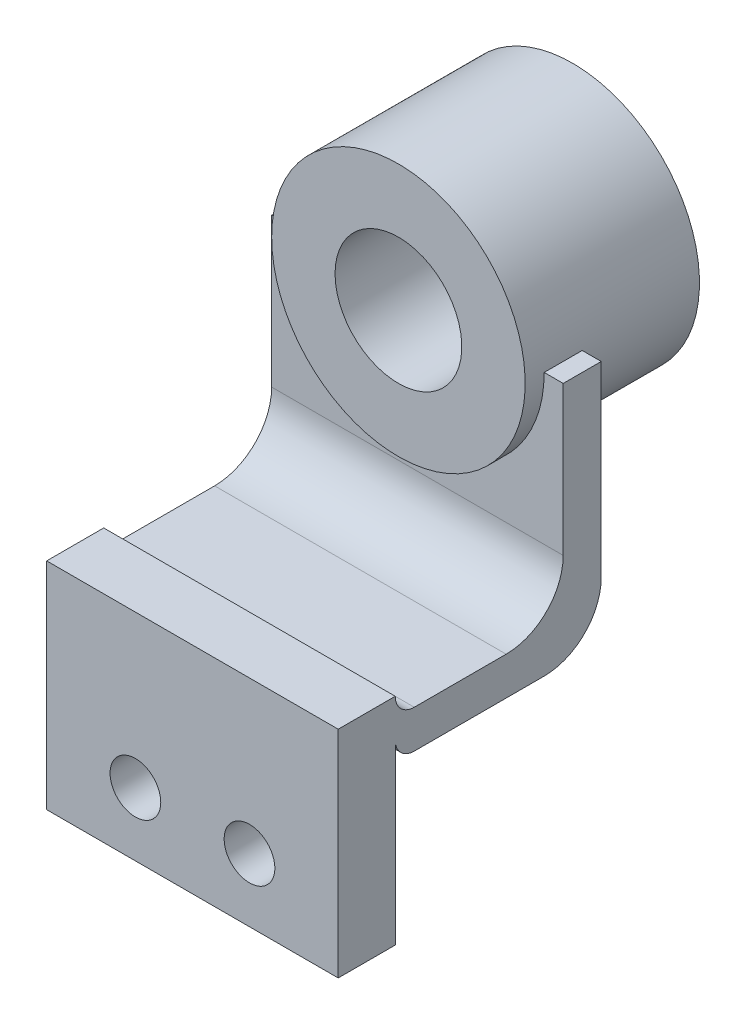
ISO-10303-21;
HEADER;
FILE_DESCRIPTION(('STEP AP214'),'2;1');
FILE_NAME('part.step','',(''),(''),'','','');
FILE_SCHEMA(('AUTOMOTIVE_DESIGN { 1 0 10303 214 1 1 1 1 }'));
ENDSEC;
DATA;
#1=APPLICATION_CONTEXT('core data for automotive mechanical design processes');
#2=APPLICATION_PROTOCOL_DEFINITION('international standard','automotive_design',2000,#1);
#3=PRODUCT_CONTEXT('',#1,'mechanical');
#4=PRODUCT('Part','Part','',(#3));
#5=PRODUCT_RELATED_PRODUCT_CATEGORY('part','',(#4));
#6=PRODUCT_DEFINITION_FORMATION('','',#4);
#7=PRODUCT_DEFINITION_CONTEXT('part definition',#1,'design');
#8=PRODUCT_DEFINITION('design','',#6,#7);
#9=PRODUCT_DEFINITION_SHAPE('','',#8);
#10=(LENGTH_UNIT() NAMED_UNIT(*) SI_UNIT(.MILLI.,.METRE.));
#11=(NAMED_UNIT(*) PLANE_ANGLE_UNIT() SI_UNIT($,.RADIAN.));
#12=(NAMED_UNIT(*) SI_UNIT($,.STERADIAN.) SOLID_ANGLE_UNIT());
#13=UNCERTAINTY_MEASURE_WITH_UNIT(LENGTH_MEASURE(1.E-05),#10,'distance_accuracy_value','');
#14=(GEOMETRIC_REPRESENTATION_CONTEXT(3) GLOBAL_UNCERTAINTY_ASSIGNED_CONTEXT((#13)) GLOBAL_UNIT_ASSIGNED_CONTEXT((#10,
#11,#12)) REPRESENTATION_CONTEXT('',''));
#15=CARTESIAN_POINT('',(0.,0.,0.));
#16=DIRECTION('',(0.,0.,1.));
#17=DIRECTION('',(1.,0.,0.));
#18=AXIS2_PLACEMENT_3D('',#15,#16,#17);
#19=CARTESIAN_POINT('',(0.,0.,0.));
#20=DIRECTION('',(0.,0.,1.));
#21=DIRECTION('',(1.,0.,0.));
#22=AXIS2_PLACEMENT_3D('',#19,#20,#21);
#23=PLANE('',#22);
#24=CARTESIAN_POINT('',(-18.,-14.,0.));
#25=DIRECTION('',(0.,0.,-1.));
#26=DIRECTION('',(1.,0.,0.));
#27=AXIS2_PLACEMENT_3D('',#24,#25,#26);
#28=CIRCLE('',#27,8.00000000000001);
#29=CARTESIAN_POINT('',(-9.99999999999998,-14.,0.));
#30=VERTEX_POINT('',#29);
#31=EDGE_CURVE('E337',#30,#30,#28,.T.);
#32=ORIENTED_EDGE('',*,*,#31,.F.);
#33=EDGE_LOOP('',(#32));
#34=FACE_BOUND('',#33,.T.);
#35=DIRECTION('',(0.,1.,0.));
#36=VECTOR('',#35,1.);
#37=CARTESIAN_POINT('',(-7.,0.,0.));
#38=LINE('',#37,#36);
#39=CARTESIAN_POINT('',(-7.,-34.,0.));
#40=VERTEX_POINT('',#39);
#41=CARTESIAN_POINT('',(-7.,22.,0.));
#42=VERTEX_POINT('',#41);
#43=EDGE_CURVE('E239',#40,#42,#38,.T.);
#44=ORIENTED_EDGE('',*,*,#43,.F.);
#45=DIRECTION('',(1.,0.,0.));
#46=VECTOR('',#45,1.);
#47=CARTESIAN_POINT('',(46.,-34.,0.));
#48=LINE('',#47,#46);
#49=CARTESIAN_POINT('',(-46.,-34.,0.));
#50=VERTEX_POINT('',#49);
#51=EDGE_CURVE('E387',#50,#40,#48,.T.);
#52=ORIENTED_EDGE('',*,*,#51,.F.);
#53=DIRECTION('',(0.,-1.,0.));
#54=VECTOR('',#53,1.);
#55=CARTESIAN_POINT('',(-46.,-34.,0.));
#56=LINE('',#55,#54);
#57=CARTESIAN_POINT('',(-46.,22.,0.));
#58=VERTEX_POINT('',#57);
#59=EDGE_CURVE('E365',#58,#50,#56,.T.);
#60=ORIENTED_EDGE('',*,*,#59,.F.);
#61=DIRECTION('',(-1.,0.,0.));
#62=VECTOR('',#61,1.);
#63=CARTESIAN_POINT('',(46.,22.,0.));
#64=LINE('',#63,#62);
#65=EDGE_CURVE('E338',#42,#58,#64,.T.);
#66=ORIENTED_EDGE('',*,*,#65,.F.);
#67=EDGE_LOOP('',(#44,#52,#60,#66));
#68=FACE_BOUND('',#67,.T.);
#69=ADVANCED_FACE('F33',(#34,#68),#23,.F.);
#70=CARTESIAN_POINT('',(46.,22.,-6.));
#71=DIRECTION('',(-1.,0.,0.));
#72=DIRECTION('',(0.,0.,1.));
#73=AXIS2_PLACEMENT_3D('',#70,#71,#72);
#74=CYLINDRICAL_SURFACE('',#73,6.);
#75=DIRECTION('',(-1.,0.,0.));
#76=VECTOR('',#75,1.);
#77=CARTESIAN_POINT('',(46.,16.,-6.00000000000004));
#78=LINE('',#77,#76);
#79=CARTESIAN_POINT('',(-7.,16.,-6.00000000000004));
#80=VERTEX_POINT('',#79);
#81=CARTESIAN_POINT('',(-46.,16.,-6.00000000000004));
#82=VERTEX_POINT('',#81);
#83=EDGE_CURVE('E342',#80,#82,#78,.T.);
#84=ORIENTED_EDGE('',*,*,#83,.F.);
#85=CARTESIAN_POINT('',(-7.,22.,-6.));
#86=DIRECTION('',(1.,0.,0.));
#87=DIRECTION('',(0.,0.,-1.));
#88=AXIS2_PLACEMENT_3D('',#85,#86,#87);
#89=CIRCLE('',#88,6.);
#90=EDGE_CURVE('E244',#80,#42,#89,.F.);
#91=ORIENTED_EDGE('',*,*,#90,.T.);
#92=ORIENTED_EDGE('',*,*,#65,.T.);
#93=CARTESIAN_POINT('',(-46.,22.,-6.));
#94=DIRECTION('',(-1.,0.,0.));
#95=DIRECTION('',(0.,0.,1.));
#96=AXIS2_PLACEMENT_3D('',#93,#94,#95);
#97=CIRCLE('',#96,6.);
#98=EDGE_CURVE('E291',#82,#58,#97,.T.);
#99=ORIENTED_EDGE('',*,*,#98,.F.);
#100=EDGE_LOOP('',(#84,#91,#92,#99));
#101=FACE_BOUND('',#100,.T.);
#102=ADVANCED_FACE('F458',(#101),#74,.T.);
#103=CARTESIAN_POINT('',(46.,16.,-6.00000000000004));
#104=DIRECTION('',(0.,-1.,0.));
#105=DIRECTION('',(0.,0.,-1.));
#106=AXIS2_PLACEMENT_3D('',#103,#104,#105);
#107=PLANE('',#106);
#108=DIRECTION('',(-1.,0.,0.));
#109=VECTOR('',#108,1.);
#110=CARTESIAN_POINT('',(46.,16.,-46.9999999999999));
#111=LINE('',#110,#109);
#112=CARTESIAN_POINT('',(-7.,16.,-46.9999999999999));
#113=VERTEX_POINT('',#112);
#114=CARTESIAN_POINT('',(-46.,16.,-46.9999999999999));
#115=VERTEX_POINT('',#114);
#116=EDGE_CURVE('E346',#113,#115,#111,.T.);
#117=ORIENTED_EDGE('',*,*,#116,.F.);
#118=DIRECTION('',(0.,0.,1.));
#119=VECTOR('',#118,1.);
#120=CARTESIAN_POINT('',(-7.,16.,-6.00000000000004));
#121=LINE('',#120,#119);
#122=EDGE_CURVE('E247',#113,#80,#121,.T.);
#123=ORIENTED_EDGE('',*,*,#122,.T.);
#124=ORIENTED_EDGE('',*,*,#83,.T.);
#125=DIRECTION('',(0.,0.,1.));
#126=VECTOR('',#125,1.);
#127=CARTESIAN_POINT('',(-46.,16.,-6.00000000000004));
#128=LINE('',#127,#126);
#129=EDGE_CURVE('E329',#115,#82,#128,.T.);
#130=ORIENTED_EDGE('',*,*,#129,.F.);
#131=EDGE_LOOP('',(#117,#123,#124,#130));
#132=FACE_BOUND('',#131,.T.);
#133=ADVANCED_FACE('F463',(#132),#107,.T.);
#134=CARTESIAN_POINT('',(46.,34.,-47.));
#135=DIRECTION('',(-1.,0.,0.));
#136=DIRECTION('',(0.,0.,1.));
#137=AXIS2_PLACEMENT_3D('',#134,#135,#136);
#138=CYLINDRICAL_SURFACE('',#137,18.);
#139=DIRECTION('',(-1.,0.,0.));
#140=VECTOR('',#139,1.);
#141=CARTESIAN_POINT('',(46.,34.0000000000001,-65.));
#142=LINE('',#141,#140);
#143=CARTESIAN_POINT('',(-7.,34.,-65.));
#144=VERTEX_POINT('',#143);
#145=CARTESIAN_POINT('',(-46.,34.0000000000001,-65.));
#146=VERTEX_POINT('',#145);
#147=EDGE_CURVE('E350',#144,#146,#142,.T.);
#148=ORIENTED_EDGE('',*,*,#147,.F.);
#149=CARTESIAN_POINT('',(-7.,34.,-47.));
#150=DIRECTION('',(1.,0.,0.));
#151=DIRECTION('',(0.,0.,-1.));
#152=AXIS2_PLACEMENT_3D('',#149,#150,#151);
#153=CIRCLE('',#152,18.);
#154=EDGE_CURVE('E250',#144,#113,#153,.F.);
#155=ORIENTED_EDGE('',*,*,#154,.T.);
#156=ORIENTED_EDGE('',*,*,#116,.T.);
#157=CARTESIAN_POINT('',(-46.,34.,-47.));
#158=DIRECTION('',(-1.,0.,0.));
#159=DIRECTION('',(0.,0.,-1.));
#160=AXIS2_PLACEMENT_3D('',#157,#158,#159);
#161=CIRCLE('',#160,18.);
#162=EDGE_CURVE('E326',#146,#115,#161,.T.);
#163=ORIENTED_EDGE('',*,*,#162,.F.);
#164=EDGE_LOOP('',(#148,#155,#156,#163));
#165=FACE_BOUND('',#164,.T.);
#166=ADVANCED_FACE('F468',(#165),#138,.T.);
#167=CARTESIAN_POINT('',(46.,34.0000000000001,-65.));
#168=DIRECTION('',(0.,0.,-1.));
#169=DIRECTION('',(-1.,0.,0.));
#170=AXIS2_PLACEMENT_3D('',#167,#168,#169);
#171=PLANE('',#170);
#172=CARTESIAN_POINT('',(0.,93.,-65.));
#173=DIRECTION('',(0.,0.,-1.));
#174=DIRECTION('',(-1.,0.,0.));
#175=AXIS2_PLACEMENT_3D('',#172,#173,#174);
#176=CIRCLE('',#175,40.);
#177=CARTESIAN_POINT('',(-7.,53.6172626649696,-65.));
#178=VERTEX_POINT('',#177);
#179=CARTESIAN_POINT('',(-40.,93.,-65.));
#180=VERTEX_POINT('',#179);
#181=EDGE_CURVE('E284',#178,#180,#176,.T.);
#182=ORIENTED_EDGE('',*,*,#181,.F.);
#183=DIRECTION('',(0.,-1.,0.));
#184=VECTOR('',#183,1.);
#185=CARTESIAN_POINT('',(-7.,34.0000000000001,-65.));
#186=LINE('',#185,#184);
#187=EDGE_CURVE('E242',#178,#144,#186,.T.);
#188=ORIENTED_EDGE('',*,*,#187,.T.);
#189=ORIENTED_EDGE('',*,*,#147,.T.);
#190=DIRECTION('',(0.,-1.,0.));
#191=VECTOR('',#190,1.);
#192=CARTESIAN_POINT('',(-46.,34.0000000000001,-65.));
#193=LINE('',#192,#191);
#194=CARTESIAN_POINT('',(-46.,93.,-65.));
#195=VERTEX_POINT('',#194);
#196=EDGE_CURVE('E323',#195,#146,#193,.T.);
#197=ORIENTED_EDGE('',*,*,#196,.F.);
#198=DIRECTION('',(-1.,0.,0.));
#199=VECTOR('',#198,1.);
#200=CARTESIAN_POINT('',(46.,93.,-65.));
#201=LINE('',#200,#199);
#202=EDGE_CURVE('E354',#180,#195,#201,.T.);
#203=ORIENTED_EDGE('',*,*,#202,.F.);
#204=EDGE_LOOP('',(#182,#188,#189,#197,#203));
#205=FACE_BOUND('',#204,.T.);
#206=ADVANCED_FACE('F473',(#205),#171,.T.);
#207=CARTESIAN_POINT('',(46.,93.,-65.));
#208=DIRECTION('',(0.,1.,0.));
#209=DIRECTION('',(0.,0.,1.));
#210=AXIS2_PLACEMENT_3D('',#207,#208,#209);
#211=PLANE('',#210);
#212=DIRECTION('',(0.,0.,-1.));
#213=VECTOR('',#212,1.);
#214=CARTESIAN_POINT('',(40.,93.,-47.));
#215=LINE('',#214,#213);
#216=CARTESIAN_POINT('',(40.,93.,-53.));
#217=VERTEX_POINT('',#216);
#218=CARTESIAN_POINT('',(40.,93.,-65.));
#219=VERTEX_POINT('',#218);
#220=EDGE_CURVE('E281',#217,#219,#215,.T.);
#221=ORIENTED_EDGE('',*,*,#220,.F.);
#222=DIRECTION('',(-1.,0.,0.));
#223=VECTOR('',#222,1.);
#224=CARTESIAN_POINT('',(46.,93.,-53.));
#225=LINE('',#224,#223);
#226=CARTESIAN_POINT('',(46.,93.,-53.));
#227=VERTEX_POINT('',#226);
#228=EDGE_CURVE('E355',#227,#217,#225,.T.);
#229=ORIENTED_EDGE('',*,*,#228,.F.);
#230=DIRECTION('',(0.,0.,-1.));
#231=VECTOR('',#230,1.);
#232=CARTESIAN_POINT('',(46.,93.,-65.));
#233=LINE('',#232,#231);
#234=CARTESIAN_POINT('',(46.,93.,-65.));
#235=VERTEX_POINT('',#234);
#236=EDGE_CURVE('E297',#227,#235,#233,.T.);
#237=ORIENTED_EDGE('',*,*,#236,.T.);
#238=EDGE_CURVE('E351',#235,#219,#201,.T.);
#239=ORIENTED_EDGE('',*,*,#238,.T.);
#240=EDGE_LOOP('',(#221,#229,#237,#239));
#241=FACE_BOUND('',#240,.T.);
#242=ADVANCED_FACE('F478',(#241),#211,.T.);
#243=CARTESIAN_POINT('',(18.,-14.,0.));
#244=DIRECTION('',(0.,0.,-1.));
#245=DIRECTION('',(-1.,0.,0.));
#246=AXIS2_PLACEMENT_3D('',#243,#244,#245);
#247=CIRCLE('',#246,8.);
#248=CARTESIAN_POINT('',(9.99999999999997,-14.,0.));
#249=VERTEX_POINT('',#248);
#250=EDGE_CURVE('E366',#249,#249,#247,.T.);
#251=ORIENTED_EDGE('',*,*,#250,.F.);
#252=EDGE_LOOP('',(#251));
#253=FACE_BOUND('',#252,.T.);
#254=CARTESIAN_POINT('',(7.,-34.,0.));
#255=VERTEX_POINT('',#254);
#256=CARTESIAN_POINT('',(46.,-34.,0.));
#257=VERTEX_POINT('',#256);
#258=EDGE_CURVE('E386',#255,#257,#48,.T.);
#259=ORIENTED_EDGE('',*,*,#258,.F.);
#260=DIRECTION('',(0.,1.,0.));
#261=VECTOR('',#260,1.);
#262=CARTESIAN_POINT('',(7.,0.,0.));
#263=LINE('',#262,#261);
#264=CARTESIAN_POINT('',(7.,22.,0.));
#265=VERTEX_POINT('',#264);
#266=EDGE_CURVE('E241',#255,#265,#263,.T.);
#267=ORIENTED_EDGE('',*,*,#266,.T.);
#268=CARTESIAN_POINT('',(46.,22.,0.));
#269=VERTEX_POINT('',#268);
#270=EDGE_CURVE('E334',#269,#265,#64,.T.);
#271=ORIENTED_EDGE('',*,*,#270,.F.);
#272=DIRECTION('',(0.,1.,0.));
#273=VECTOR('',#272,1.);
#274=CARTESIAN_POINT('',(46.,-34.,0.));
#275=LINE('',#274,#273);
#276=EDGE_CURVE('E390',#257,#269,#275,.T.);
#277=ORIENTED_EDGE('',*,*,#276,.F.);
#278=EDGE_LOOP('',(#259,#267,#271,#277));
#279=FACE_BOUND('',#278,.T.);
#280=ADVANCED_FACE('F502',(#253,#279),#23,.F.);
#281=CARTESIAN_POINT('',(-46.,-34.,18.));
#282=DIRECTION('',(1.,0.,0.));
#283=DIRECTION('',(0.,0.,-1.));
#284=AXIS2_PLACEMENT_3D('',#281,#282,#283);
#285=PLANE('',#284);
#286=DIRECTION('',(0.,0.,-1.));
#287=VECTOR('',#286,1.);
#288=CARTESIAN_POINT('',(-46.,34.,18.));
#289=LINE('',#288,#287);
#290=CARTESIAN_POINT('',(-46.,34.,18.));
#291=VERTEX_POINT('',#290);
#292=CARTESIAN_POINT('',(-46.,34.,0.));
#293=VERTEX_POINT('',#292);
#294=EDGE_CURVE('E384',#291,#293,#289,.T.);
#295=ORIENTED_EDGE('',*,*,#294,.T.);
#296=CARTESIAN_POINT('',(-46.,34.,-6.));
#297=DIRECTION('',(1.,0.,0.));
#298=DIRECTION('',(0.,0.,-1.));
#299=AXIS2_PLACEMENT_3D('',#296,#297,#298);
#300=CIRCLE('',#299,6.);
#301=CARTESIAN_POINT('',(-46.,28.,-6.));
#302=VERTEX_POINT('',#301);
#303=EDGE_CURVE('E408',#293,#302,#300,.T.);
#304=ORIENTED_EDGE('',*,*,#303,.T.);
#305=DIRECTION('',(0.,0.,-1.));
#306=VECTOR('',#305,1.);
#307=CARTESIAN_POINT('',(-46.,28.,0.));
#308=LINE('',#307,#306);
#309=CARTESIAN_POINT('',(-46.,28.,-34.9999999999999));
#310=VERTEX_POINT('',#309);
#311=EDGE_CURVE('E287',#302,#310,#308,.T.);
#312=ORIENTED_EDGE('',*,*,#311,.T.);
#313=CARTESIAN_POINT('',(-46.,46.,-35.));
#314=DIRECTION('',(1.,0.,0.));
#315=DIRECTION('',(0.,0.,-1.));
#316=AXIS2_PLACEMENT_3D('',#313,#314,#315);
#317=CIRCLE('',#316,18.);
#318=CARTESIAN_POINT('',(-46.,46.,-53.));
#319=VERTEX_POINT('',#318);
#320=EDGE_CURVE('E314',#310,#319,#317,.T.);
#321=ORIENTED_EDGE('',*,*,#320,.T.);
#322=DIRECTION('',(0.,1.,0.));
#323=VECTOR('',#322,1.);
#324=CARTESIAN_POINT('',(-46.,46.0000000000001,-53.));
#325=LINE('',#324,#323);
#326=CARTESIAN_POINT('',(-46.,93.,-53.));
#327=VERTEX_POINT('',#326);
#328=EDGE_CURVE('E317',#319,#327,#325,.T.);
#329=ORIENTED_EDGE('',*,*,#328,.T.);
#330=DIRECTION('',(0.,0.,-1.));
#331=VECTOR('',#330,1.);
#332=CARTESIAN_POINT('',(-46.,93.,-65.));
#333=LINE('',#332,#331);
#334=EDGE_CURVE('E320',#327,#195,#333,.T.);
#335=ORIENTED_EDGE('',*,*,#334,.T.);
#336=ORIENTED_EDGE('',*,*,#196,.T.);
#337=ORIENTED_EDGE('',*,*,#162,.T.);
#338=ORIENTED_EDGE('',*,*,#129,.T.);
#339=ORIENTED_EDGE('',*,*,#98,.T.);
#340=ORIENTED_EDGE('',*,*,#59,.T.);
#341=DIRECTION('',(0.,0.,-1.));
#342=VECTOR('',#341,1.);
#343=CARTESIAN_POINT('',(-46.,-34.,18.));
#344=LINE('',#343,#342);
#345=CARTESIAN_POINT('',(-46.,-34.,18.));
#346=VERTEX_POINT('',#345);
#347=EDGE_CURVE('E403',#346,#50,#344,.T.);
#348=ORIENTED_EDGE('',*,*,#347,.F.);
#349=DIRECTION('',(0.,-1.,0.));
#350=VECTOR('',#349,1.);
#351=CARTESIAN_POINT('',(-46.,-34.,18.));
#352=LINE('',#351,#350);
#353=EDGE_CURVE('E374',#291,#346,#352,.T.);
#354=ORIENTED_EDGE('',*,*,#353,.F.);
#355=EDGE_LOOP('',(#295,#304,#312,#321,#329,#335,#336,#337,#338,#339,#340,#348,#354));
#356=FACE_BOUND('',#355,.T.);
#357=ADVANCED_FACE('F505',(#356),#285,.F.);
#358=CARTESIAN_POINT('',(46.,-34.,18.));
#359=DIRECTION('',(0.,1.,0.));
#360=DIRECTION('',(-1.,0.,0.));
#361=AXIS2_PLACEMENT_3D('',#358,#359,#360);
#362=PLANE('',#361);
#363=DIRECTION('',(0.,0.,-1.));
#364=VECTOR('',#363,1.);
#365=CARTESIAN_POINT('',(46.,-34.,18.));
#366=LINE('',#365,#364);
#367=CARTESIAN_POINT('',(46.,-34.,18.));
#368=VERTEX_POINT('',#367);
#369=EDGE_CURVE('E400',#368,#257,#366,.T.);
#370=ORIENTED_EDGE('',*,*,#369,.F.);
#371=DIRECTION('',(1.,0.,0.));
#372=VECTOR('',#371,1.);
#373=CARTESIAN_POINT('',(46.,-34.,18.));
#374=LINE('',#373,#372);
#375=EDGE_CURVE('E377',#346,#368,#374,.T.);
#376=ORIENTED_EDGE('',*,*,#375,.F.);
#377=ORIENTED_EDGE('',*,*,#347,.T.);
#378=ORIENTED_EDGE('',*,*,#51,.T.);
#379=EDGE_CURVE('E391',#40,#255,#48,.T.);
#380=ORIENTED_EDGE('',*,*,#379,.T.);
#381=ORIENTED_EDGE('',*,*,#258,.T.);
#382=EDGE_LOOP('',(#370,#376,#377,#378,#380,#381));
#383=FACE_BOUND('',#382,.T.);
#384=ADVANCED_FACE('F513',(#383),#362,.F.);
#385=CARTESIAN_POINT('',(46.,-34.,18.));
#386=DIRECTION('',(-1.,0.,0.));
#387=DIRECTION('',(0.,-1.,0.));
#388=AXIS2_PLACEMENT_3D('',#385,#386,#387);
#389=PLANE('',#388);
#390=ORIENTED_EDGE('',*,*,#276,.T.);
#391=CARTESIAN_POINT('',(46.,22.,-6.));
#392=DIRECTION('',(-1.,0.,0.));
#393=DIRECTION('',(0.,0.,1.));
#394=AXIS2_PLACEMENT_3D('',#391,#392,#393);
#395=CIRCLE('',#394,6.);
#396=CARTESIAN_POINT('',(46.,16.,-6.00000000000004));
#397=VERTEX_POINT('',#396);
#398=EDGE_CURVE('E309',#397,#269,#395,.T.);
#399=ORIENTED_EDGE('',*,*,#398,.F.);
#400=DIRECTION('',(0.,0.,1.));
#401=VECTOR('',#400,1.);
#402=CARTESIAN_POINT('',(46.,16.,-6.00000000000004));
#403=LINE('',#402,#401);
#404=CARTESIAN_POINT('',(46.,16.,-46.9999999999999));
#405=VERTEX_POINT('',#404);
#406=EDGE_CURVE('E306',#405,#397,#403,.T.);
#407=ORIENTED_EDGE('',*,*,#406,.F.);
#408=CARTESIAN_POINT('',(46.,34.,-47.));
#409=DIRECTION('',(-1.,0.,0.));
#410=DIRECTION('',(0.,0.,-1.));
#411=AXIS2_PLACEMENT_3D('',#408,#409,#410);
#412=CIRCLE('',#411,18.);
#413=CARTESIAN_POINT('',(46.,34.0000000000001,-65.));
#414=VERTEX_POINT('',#413);
#415=EDGE_CURVE('E303',#414,#405,#412,.T.);
#416=ORIENTED_EDGE('',*,*,#415,.F.);
#417=DIRECTION('',(0.,-1.,0.));
#418=VECTOR('',#417,1.);
#419=CARTESIAN_POINT('',(46.,34.0000000000001,-65.));
#420=LINE('',#419,#418);
#421=EDGE_CURVE('E300',#235,#414,#420,.T.);
#422=ORIENTED_EDGE('',*,*,#421,.F.);
#423=ORIENTED_EDGE('',*,*,#236,.F.);
#424=DIRECTION('',(0.,1.,0.));
#425=VECTOR('',#424,1.);
#426=CARTESIAN_POINT('',(46.,46.0000000000001,-53.));
#427=LINE('',#426,#425);
#428=CARTESIAN_POINT('',(46.,46.,-53.));
#429=VERTEX_POINT('',#428);
#430=EDGE_CURVE('E294',#429,#227,#427,.T.);
#431=ORIENTED_EDGE('',*,*,#430,.F.);
#432=CARTESIAN_POINT('',(46.,46.,-35.));
#433=DIRECTION('',(1.,0.,0.));
#434=DIRECTION('',(0.,0.,-1.));
#435=AXIS2_PLACEMENT_3D('',#432,#433,#434);
#436=CIRCLE('',#435,18.);
#437=CARTESIAN_POINT('',(46.,28.,-34.9999999999999));
#438=VERTEX_POINT('',#437);
#439=EDGE_CURVE('E290',#438,#429,#436,.T.);
#440=ORIENTED_EDGE('',*,*,#439,.F.);
#441=DIRECTION('',(0.,0.,-1.));
#442=VECTOR('',#441,1.);
#443=CARTESIAN_POINT('',(46.,28.,0.));
#444=LINE('',#443,#442);
#445=CARTESIAN_POINT('',(46.,28.,-6.));
#446=VERTEX_POINT('',#445);
#447=EDGE_CURVE('E288',#446,#438,#444,.T.);
#448=ORIENTED_EDGE('',*,*,#447,.F.);
#449=CARTESIAN_POINT('',(46.,34.,-6.));
#450=DIRECTION('',(-1.,0.,0.));
#451=DIRECTION('',(0.,-1.,0.));
#452=AXIS2_PLACEMENT_3D('',#449,#450,#451);
#453=CIRCLE('',#452,6.);
#454=CARTESIAN_POINT('',(46.,34.,0.));
#455=VERTEX_POINT('',#454);
#456=EDGE_CURVE('E410',#446,#455,#453,.T.);
#457=ORIENTED_EDGE('',*,*,#456,.T.);
#458=DIRECTION('',(0.,0.,-1.));
#459=VECTOR('',#458,1.);
#460=CARTESIAN_POINT('',(46.,34.,18.));
#461=LINE('',#460,#459);
#462=CARTESIAN_POINT('',(46.,34.,18.));
#463=VERTEX_POINT('',#462);
#464=EDGE_CURVE('E397',#463,#455,#461,.T.);
#465=ORIENTED_EDGE('',*,*,#464,.F.);
#466=DIRECTION('',(0.,1.,0.));
#467=VECTOR('',#466,1.);
#468=CARTESIAN_POINT('',(46.,-34.,18.));
#469=LINE('',#468,#467);
#470=EDGE_CURVE('E380',#368,#463,#469,.T.);
#471=ORIENTED_EDGE('',*,*,#470,.F.);
#472=ORIENTED_EDGE('',*,*,#369,.T.);
#473=EDGE_LOOP('',(#390,#399,#407,#416,#422,#423,#431,#440,#448,#457,#465,#471,#472));
#474=FACE_BOUND('',#473,.T.);
#475=ADVANCED_FACE('F509',(#474),#389,.F.);
#476=CARTESIAN_POINT('',(46.,34.,18.));
#477=DIRECTION('',(0.,-1.,0.));
#478=DIRECTION('',(1.,0.,0.));
#479=AXIS2_PLACEMENT_3D('',#476,#477,#478);
#480=PLANE('',#479);
#481=DIRECTION('',(-1.,0.,0.));
#482=VECTOR('',#481,1.);
#483=CARTESIAN_POINT('',(46.,34.,0.));
#484=LINE('',#483,#482);
#485=EDGE_CURVE('E378',#455,#293,#484,.T.);
#486=ORIENTED_EDGE('',*,*,#485,.T.);
#487=ORIENTED_EDGE('',*,*,#294,.F.);
#488=DIRECTION('',(-1.,0.,0.));
#489=VECTOR('',#488,1.);
#490=CARTESIAN_POINT('',(46.,34.,18.));
#491=LINE('',#490,#489);
#492=EDGE_CURVE('E382',#463,#291,#491,.T.);
#493=ORIENTED_EDGE('',*,*,#492,.F.);
#494=ORIENTED_EDGE('',*,*,#464,.T.);
#495=EDGE_LOOP('',(#486,#487,#493,#494));
#496=FACE_BOUND('',#495,.T.);
#497=ADVANCED_FACE('F500',(#496),#480,.F.);
#498=CARTESIAN_POINT('',(0.,0.,18.));
#499=DIRECTION('',(0.,0.,1.));
#500=DIRECTION('',(1.,0.,0.));
#501=AXIS2_PLACEMENT_3D('',#498,#499,#500);
#502=PLANE('',#501);
#503=ORIENTED_EDGE('',*,*,#492,.T.);
#504=ORIENTED_EDGE('',*,*,#353,.T.);
#505=ORIENTED_EDGE('',*,*,#375,.T.);
#506=ORIENTED_EDGE('',*,*,#470,.T.);
#507=EDGE_LOOP('',(#503,#504,#505,#506));
#508=FACE_BOUND('',#507,.T.);
#509=CARTESIAN_POINT('',(18.,-14.,18.));
#510=DIRECTION('',(0.,0.,-1.));
#511=DIRECTION('',(-1.,0.,0.));
#512=AXIS2_PLACEMENT_3D('',#509,#510,#511);
#513=CIRCLE('',#512,8.);
#514=CARTESIAN_POINT('',(9.99999999999997,-14.,18.));
#515=VERTEX_POINT('',#514);
#516=EDGE_CURVE('E362',#515,#515,#513,.T.);
#517=ORIENTED_EDGE('',*,*,#516,.T.);
#518=EDGE_LOOP('',(#517));
#519=FACE_BOUND('',#518,.T.);
#520=CARTESIAN_POINT('',(-18.,-14.,18.));
#521=DIRECTION('',(0.,0.,-1.));
#522=DIRECTION('',(1.,0.,0.));
#523=AXIS2_PLACEMENT_3D('',#520,#521,#522);
#524=CIRCLE('',#523,8.00000000000001);
#525=CARTESIAN_POINT('',(-9.99999999999998,-14.,18.));
#526=VERTEX_POINT('',#525);
#527=EDGE_CURVE('E369',#526,#526,#524,.T.);
#528=ORIENTED_EDGE('',*,*,#527,.T.);
#529=EDGE_LOOP('',(#528));
#530=FACE_BOUND('',#529,.T.);
#531=ADVANCED_FACE('F496',(#508,#519,#530),#502,.T.);
#532=CARTESIAN_POINT('',(-18.,-14.,18.));
#533=DIRECTION('',(0.,0.,-1.));
#534=DIRECTION('',(-1.,0.,0.));
#535=AXIS2_PLACEMENT_3D('',#532,#533,#534);
#536=CYLINDRICAL_SURFACE('',#535,8.00000000000001);
#537=ORIENTED_EDGE('',*,*,#527,.F.);
#538=EDGE_LOOP('',(#537));
#539=FACE_BOUND('',#538,.T.);
#540=ORIENTED_EDGE('',*,*,#31,.T.);
#541=EDGE_LOOP('',(#540));
#542=FACE_BOUND('',#541,.T.);
#543=ADVANCED_FACE('F492',(#539,#542),#536,.F.);
#544=CARTESIAN_POINT('',(18.,-14.,18.));
#545=DIRECTION('',(0.,0.,-1.));
#546=DIRECTION('',(-1.,0.,0.));
#547=AXIS2_PLACEMENT_3D('',#544,#545,#546);
#548=CYLINDRICAL_SURFACE('',#547,8.);
#549=ORIENTED_EDGE('',*,*,#516,.F.);
#550=EDGE_LOOP('',(#549));
#551=FACE_BOUND('',#550,.T.);
#552=ORIENTED_EDGE('',*,*,#250,.T.);
#553=EDGE_LOOP('',(#552));
#554=FACE_BOUND('',#553,.T.);
#555=ADVANCED_FACE('F456',(#551,#554),#548,.F.);
#556=CARTESIAN_POINT('',(7.,22.,-6.));
#557=DIRECTION('',(1.,0.,0.));
#558=DIRECTION('',(0.,0.,-1.));
#559=AXIS2_PLACEMENT_3D('',#556,#557,#558);
#560=CIRCLE('',#559,6.);
#561=CARTESIAN_POINT('',(7.,16.,-6.00000000000004));
#562=VERTEX_POINT('',#561);
#563=EDGE_CURVE('E260',#562,#265,#560,.F.);
#564=ORIENTED_EDGE('',*,*,#563,.F.);
#565=EDGE_CURVE('E339',#397,#562,#78,.T.);
#566=ORIENTED_EDGE('',*,*,#565,.F.);
#567=ORIENTED_EDGE('',*,*,#398,.T.);
#568=ORIENTED_EDGE('',*,*,#270,.T.);
#569=EDGE_LOOP('',(#564,#566,#567,#568));
#570=FACE_BOUND('',#569,.T.);
#571=ADVANCED_FACE('F452',(#570),#74,.T.);
#572=DIRECTION('',(0.,0.,1.));
#573=VECTOR('',#572,1.);
#574=CARTESIAN_POINT('',(7.,16.,-6.00000000000004));
#575=LINE('',#574,#573);
#576=CARTESIAN_POINT('',(7.,16.,-46.9999999999999));
#577=VERTEX_POINT('',#576);
#578=EDGE_CURVE('E262',#577,#562,#575,.T.);
#579=ORIENTED_EDGE('',*,*,#578,.F.);
#580=EDGE_CURVE('E343',#405,#577,#111,.T.);
#581=ORIENTED_EDGE('',*,*,#580,.F.);
#582=ORIENTED_EDGE('',*,*,#406,.T.);
#583=ORIENTED_EDGE('',*,*,#565,.T.);
#584=EDGE_LOOP('',(#579,#581,#582,#583));
#585=FACE_BOUND('',#584,.T.);
#586=ADVANCED_FACE('F455',(#585),#107,.T.);
#587=CARTESIAN_POINT('',(7.,34.,-47.));
#588=DIRECTION('',(1.,0.,0.));
#589=DIRECTION('',(0.,0.,-1.));
#590=AXIS2_PLACEMENT_3D('',#587,#588,#589);
#591=CIRCLE('',#590,18.);
#592=CARTESIAN_POINT('',(7.,34.,-65.));
#593=VERTEX_POINT('',#592);
#594=EDGE_CURVE('E264',#593,#577,#591,.F.);
#595=ORIENTED_EDGE('',*,*,#594,.F.);
#596=EDGE_CURVE('E347',#414,#593,#142,.T.);
#597=ORIENTED_EDGE('',*,*,#596,.F.);
#598=ORIENTED_EDGE('',*,*,#415,.T.);
#599=ORIENTED_EDGE('',*,*,#580,.T.);
#600=EDGE_LOOP('',(#595,#597,#598,#599));
#601=FACE_BOUND('',#600,.T.);
#602=ADVANCED_FACE('F461',(#601),#138,.T.);
#603=DIRECTION('',(0.,-1.,0.));
#604=VECTOR('',#603,1.);
#605=CARTESIAN_POINT('',(7.,34.0000000000001,-65.));
#606=LINE('',#605,#604);
#607=CARTESIAN_POINT('',(7.,53.6172626649696,-65.));
#608=VERTEX_POINT('',#607);
#609=EDGE_CURVE('E257',#608,#593,#606,.T.);
#610=ORIENTED_EDGE('',*,*,#609,.F.);
#611=EDGE_CURVE('E285',#219,#608,#176,.T.);
#612=ORIENTED_EDGE('',*,*,#611,.F.);
#613=ORIENTED_EDGE('',*,*,#238,.F.);
#614=ORIENTED_EDGE('',*,*,#421,.T.);
#615=ORIENTED_EDGE('',*,*,#596,.T.);
#616=EDGE_LOOP('',(#610,#612,#613,#614,#615));
#617=FACE_BOUND('',#616,.T.);
#618=ADVANCED_FACE('F466',(#617),#171,.T.);
#619=DIRECTION('',(0.,0.,-1.));
#620=VECTOR('',#619,1.);
#621=CARTESIAN_POINT('',(-40.,93.,-47.));
#622=LINE('',#621,#620);
#623=CARTESIAN_POINT('',(-40.,93.,-53.));
#624=VERTEX_POINT('',#623);
#625=EDGE_CURVE('E278',#180,#624,#622,.F.);
#626=ORIENTED_EDGE('',*,*,#625,.F.);
#627=ORIENTED_EDGE('',*,*,#202,.T.);
#628=ORIENTED_EDGE('',*,*,#334,.F.);
#629=EDGE_CURVE('E358',#624,#327,#225,.T.);
#630=ORIENTED_EDGE('',*,*,#629,.F.);
#631=EDGE_LOOP('',(#626,#627,#628,#630));
#632=FACE_BOUND('',#631,.T.);
#633=ADVANCED_FACE('F471',(#632),#211,.T.);
#634=CARTESIAN_POINT('',(46.,46.0000000000001,-53.));
#635=DIRECTION('',(0.,0.,1.));
#636=DIRECTION('',(1.,0.,0.));
#637=AXIS2_PLACEMENT_3D('',#634,#635,#636);
#638=PLANE('',#637);
#639=ORIENTED_EDGE('',*,*,#228,.T.);
#640=CARTESIAN_POINT('',(0.,93.,-53.));
#641=DIRECTION('',(0.,0.,1.));
#642=DIRECTION('',(1.,0.,0.));
#643=AXIS2_PLACEMENT_3D('',#640,#641,#642);
#644=CIRCLE('',#643,40.);
#645=EDGE_CURVE('E412',#624,#217,#644,.T.);
#646=ORIENTED_EDGE('',*,*,#645,.F.);
#647=ORIENTED_EDGE('',*,*,#629,.T.);
#648=ORIENTED_EDGE('',*,*,#328,.F.);
#649=DIRECTION('',(-1.,0.,0.));
#650=VECTOR('',#649,1.);
#651=CARTESIAN_POINT('',(46.,46.,-53.));
#652=LINE('',#651,#650);
#653=EDGE_CURVE('E359',#429,#319,#652,.T.);
#654=ORIENTED_EDGE('',*,*,#653,.F.);
#655=ORIENTED_EDGE('',*,*,#430,.T.);
#656=EDGE_LOOP('',(#639,#646,#647,#648,#654,#655));
#657=FACE_BOUND('',#656,.T.);
#658=ADVANCED_FACE('F476',(#657),#638,.T.);
#659=CARTESIAN_POINT('',(46.,46.,-35.));
#660=DIRECTION('',(-1.,0.,0.));
#661=DIRECTION('',(0.,0.,1.));
#662=AXIS2_PLACEMENT_3D('',#659,#660,#661);
#663=CYLINDRICAL_SURFACE('',#662,18.);
#664=ORIENTED_EDGE('',*,*,#653,.T.);
#665=ORIENTED_EDGE('',*,*,#320,.F.);
#666=DIRECTION('',(-1.,0.,0.));
#667=VECTOR('',#666,1.);
#668=CARTESIAN_POINT('',(46.,28.,-34.9999999999999));
#669=LINE('',#668,#667);
#670=EDGE_CURVE('E311',#438,#310,#669,.T.);
#671=ORIENTED_EDGE('',*,*,#670,.F.);
#672=ORIENTED_EDGE('',*,*,#439,.T.);
#673=EDGE_LOOP('',(#664,#665,#671,#672));
#674=FACE_BOUND('',#673,.T.);
#675=ADVANCED_FACE('F481',(#674),#663,.F.);
#676=CARTESIAN_POINT('',(46.,28.,0.));
#677=DIRECTION('',(0.,1.,0.));
#678=DIRECTION('',(0.,0.,1.));
#679=AXIS2_PLACEMENT_3D('',#676,#677,#678);
#680=PLANE('',#679);
#681=ORIENTED_EDGE('',*,*,#670,.T.);
#682=ORIENTED_EDGE('',*,*,#311,.F.);
#683=DIRECTION('',(-1.,0.,0.));
#684=VECTOR('',#683,1.);
#685=CARTESIAN_POINT('',(46.,28.,-6.));
#686=LINE('',#685,#684);
#687=EDGE_CURVE('E406',#302,#446,#686,.F.);
#688=ORIENTED_EDGE('',*,*,#687,.T.);
#689=ORIENTED_EDGE('',*,*,#447,.T.);
#690=EDGE_LOOP('',(#681,#682,#688,#689));
#691=FACE_BOUND('',#690,.T.);
#692=ADVANCED_FACE('F485',(#691),#680,.T.);
#693=CARTESIAN_POINT('',(0.,34.,-6.));
#694=DIRECTION('',(-1.,0.,0.));
#695=DIRECTION('',(0.,0.,1.));
#696=AXIS2_PLACEMENT_3D('',#693,#694,#695);
#697=CYLINDRICAL_SURFACE('',#696,6.);
#698=ORIENTED_EDGE('',*,*,#456,.F.);
#699=ORIENTED_EDGE('',*,*,#687,.F.);
#700=ORIENTED_EDGE('',*,*,#303,.F.);
#701=ORIENTED_EDGE('',*,*,#485,.F.);
#702=EDGE_LOOP('',(#698,#699,#700,#701));
#703=FACE_BOUND('',#702,.T.);
#704=ADVANCED_FACE('F450',(#703),#697,.F.);
#705=CARTESIAN_POINT('',(0.,93.,-47.));
#706=DIRECTION('',(0.,0.,-1.));
#707=DIRECTION('',(-1.,0.,0.));
#708=AXIS2_PLACEMENT_3D('',#705,#706,#707);
#709=CYLINDRICAL_SURFACE('',#708,40.);
#710=CARTESIAN_POINT('',(0.,93.,-47.));
#711=DIRECTION('',(0.,0.,-1.));
#712=DIRECTION('',(-1.,0.,0.));
#713=AXIS2_PLACEMENT_3D('',#710,#711,#712);
#714=CIRCLE('',#713,40.);
#715=CARTESIAN_POINT('',(-40.,93.,-47.));
#716=VERTEX_POINT('',#715);
#717=EDGE_CURVE('E275',#716,#716,#714,.T.);
#718=ORIENTED_EDGE('',*,*,#717,.T.);
#719=EDGE_LOOP('',(#718));
#720=FACE_BOUND('',#719,.T.);
#721=DIRECTION('',(0.,0.,-1.));
#722=VECTOR('',#721,1.);
#723=CARTESIAN_POINT('',(7.,53.6172626649696,-47.));
#724=LINE('',#723,#722);
#725=CARTESIAN_POINT('',(7.,53.6172626649696,-95.));
#726=VERTEX_POINT('',#725);
#727=EDGE_CURVE('E54',#726,#608,#724,.F.);
#728=ORIENTED_EDGE('',*,*,#727,.F.);
#729=CARTESIAN_POINT('',(0.,93.,-95.));
#730=DIRECTION('',(0.,0.,1.));
#731=DIRECTION('',(1.,0.,0.));
#732=AXIS2_PLACEMENT_3D('',#729,#730,#731);
#733=CIRCLE('',#732,40.);
#734=CARTESIAN_POINT('',(-7.,53.6172626649696,-95.));
#735=VERTEX_POINT('',#734);
#736=EDGE_CURVE('E415',#726,#735,#733,.F.);
#737=ORIENTED_EDGE('',*,*,#736,.T.);
#738=DIRECTION('',(0.,0.,-1.));
#739=VECTOR('',#738,1.);
#740=CARTESIAN_POINT('',(-7.,53.6172626649696,-47.));
#741=LINE('',#740,#739);
#742=EDGE_CURVE('E61',#735,#178,#741,.F.);
#743=ORIENTED_EDGE('',*,*,#742,.T.);
#744=ORIENTED_EDGE('',*,*,#181,.T.);
#745=ORIENTED_EDGE('',*,*,#625,.T.);
#746=ORIENTED_EDGE('',*,*,#645,.T.);
#747=ORIENTED_EDGE('',*,*,#220,.T.);
#748=ORIENTED_EDGE('',*,*,#611,.T.);
#749=EDGE_LOOP('',(#728,#737,#743,#744,#745,#746,#747,#748));
#750=FACE_BOUND('',#749,.T.);
#751=CARTESIAN_POINT('',(0.,93.,-102.));
#752=DIRECTION('',(0.,0.,-1.));
#753=DIRECTION('',(-1.,0.,0.));
#754=AXIS2_PLACEMENT_3D('',#751,#752,#753);
#755=CIRCLE('',#754,40.);
#756=CARTESIAN_POINT('',(-40.,93.,-102.));
#757=VERTEX_POINT('',#756);
#758=EDGE_CURVE('E272',#757,#757,#755,.T.);
#759=ORIENTED_EDGE('',*,*,#758,.F.);
#760=EDGE_LOOP('',(#759));
#761=FACE_BOUND('',#760,.T.);
#762=ADVANCED_FACE('F446',(#720,#750,#761),#709,.T.);
#763=CARTESIAN_POINT('',(0.,93.,-47.));
#764=DIRECTION('',(0.,0.,-1.));
#765=DIRECTION('',(-1.,0.,0.));
#766=AXIS2_PLACEMENT_3D('',#763,#764,#765);
#767=PLANE('',#766);
#768=ORIENTED_EDGE('',*,*,#717,.F.);
#769=EDGE_LOOP('',(#768));
#770=FACE_BOUND('',#769,.T.);
#771=CARTESIAN_POINT('',(0.,93.,-47.));
#772=DIRECTION('',(0.,0.,-1.));
#773=DIRECTION('',(-1.,0.,0.));
#774=AXIS2_PLACEMENT_3D('',#771,#772,#773);
#775=CIRCLE('',#774,20.);
#776=CARTESIAN_POINT('',(-20.,93.,-47.));
#777=VERTEX_POINT('',#776);
#778=EDGE_CURVE('E269',#777,#777,#775,.T.);
#779=ORIENTED_EDGE('',*,*,#778,.T.);
#780=EDGE_LOOP('',(#779));
#781=FACE_BOUND('',#780,.T.);
#782=ADVANCED_FACE('F442',(#770,#781),#767,.F.);
#783=CARTESIAN_POINT('',(0.,93.,-102.));
#784=DIRECTION('',(0.,0.,-1.));
#785=DIRECTION('',(-1.,0.,0.));
#786=AXIS2_PLACEMENT_3D('',#783,#784,#785);
#787=PLANE('',#786);
#788=CARTESIAN_POINT('',(0.,93.,-102.));
#789=DIRECTION('',(0.,0.,-1.));
#790=DIRECTION('',(-1.,0.,0.));
#791=AXIS2_PLACEMENT_3D('',#788,#789,#790);
#792=CIRCLE('',#791,20.);
#793=CARTESIAN_POINT('',(-20.,93.,-102.));
#794=VERTEX_POINT('',#793);
#795=EDGE_CURVE('E256',#794,#794,#792,.T.);
#796=ORIENTED_EDGE('',*,*,#795,.F.);
#797=EDGE_LOOP('',(#796));
#798=FACE_BOUND('',#797,.T.);
#799=ORIENTED_EDGE('',*,*,#758,.T.);
#800=EDGE_LOOP('',(#799));
#801=FACE_BOUND('',#800,.T.);
#802=ADVANCED_FACE('F438',(#798,#801),#787,.T.);
#803=CARTESIAN_POINT('',(0.,93.,-12.));
#804=DIRECTION('',(0.,0.,-1.));
#805=DIRECTION('',(-1.,0.,0.));
#806=AXIS2_PLACEMENT_3D('',#803,#804,#805);
#807=CYLINDRICAL_SURFACE('',#806,20.);
#808=CARTESIAN_POINT('',(-20.,93.,-102.));
#809=CARTESIAN_POINT('',(-20.,93.,-101.427083333333));
#810=CARTESIAN_POINT('',(-20.,93.,-100.854166666667));
#811=CARTESIAN_POINT('',(-20.,93.,-99.7083333333333));
#812=CARTESIAN_POINT('',(-20.,93.,-99.1354166666667));
#813=CARTESIAN_POINT('',(-20.,93.,-97.9895833333333));
#814=CARTESIAN_POINT('',(-20.,93.,-97.4166666666667));
#815=CARTESIAN_POINT('',(-20.,93.,-96.2708333333333));
#816=CARTESIAN_POINT('',(-20.,93.,-95.6979166666667));
#817=CARTESIAN_POINT('',(-20.,93.,-94.5520833333333));
#818=CARTESIAN_POINT('',(-20.,93.,-93.9791666666667));
#819=CARTESIAN_POINT('',(-20.,93.,-92.8333333333333));
#820=CARTESIAN_POINT('',(-20.,93.,-92.2604166666667));
#821=CARTESIAN_POINT('',(-20.,93.,-91.1145833333333));
#822=CARTESIAN_POINT('',(-20.,93.,-90.5416666666667));
#823=CARTESIAN_POINT('',(-20.,93.,-89.3958333333333));
#824=CARTESIAN_POINT('',(-20.,93.,-88.8229166666667));
#825=CARTESIAN_POINT('',(-20.,93.,-87.6770833333333));
#826=CARTESIAN_POINT('',(-20.,93.,-87.1041666666667));
#827=CARTESIAN_POINT('',(-20.,93.,-85.9583333333333));
#828=CARTESIAN_POINT('',(-20.,93.,-85.3854166666667));
#829=CARTESIAN_POINT('',(-20.,93.,-84.2395833333333));
#830=CARTESIAN_POINT('',(-20.,93.,-83.6666666666667));
#831=CARTESIAN_POINT('',(-20.,93.,-82.5208333333333));
#832=CARTESIAN_POINT('',(-20.,93.,-81.9479166666667));
#833=CARTESIAN_POINT('',(-20.,93.,-80.8020833333333));
#834=CARTESIAN_POINT('',(-20.,93.,-80.2291666666667));
#835=CARTESIAN_POINT('',(-20.,93.,-79.0833333333333));
#836=CARTESIAN_POINT('',(-20.,93.,-78.5104166666667));
#837=CARTESIAN_POINT('',(-20.,93.,-77.3645833333333));
#838=CARTESIAN_POINT('',(-20.,93.,-76.7916666666667));
#839=CARTESIAN_POINT('',(-20.,93.,-75.6458333333333));
#840=CARTESIAN_POINT('',(-20.,93.,-75.0729166666667));
#841=CARTESIAN_POINT('',(-20.,93.,-73.9270833333333));
#842=CARTESIAN_POINT('',(-20.,93.,-73.3541666666667));
#843=CARTESIAN_POINT('',(-20.,93.,-72.2083333333333));
#844=CARTESIAN_POINT('',(-20.,93.,-71.6354166666667));
#845=CARTESIAN_POINT('',(-20.,93.,-70.4895833333333));
#846=CARTESIAN_POINT('',(-20.,93.,-69.9166666666667));
#847=CARTESIAN_POINT('',(-20.,93.,-68.7708333333333));
#848=CARTESIAN_POINT('',(-20.,93.,-68.1979166666667));
#849=CARTESIAN_POINT('',(-20.,93.,-67.0520833333333));
#850=CARTESIAN_POINT('',(-20.,93.,-66.4791666666667));
#851=CARTESIAN_POINT('',(-20.,93.,-65.3333333333333));
#852=CARTESIAN_POINT('',(-20.,93.,-64.7604166666667));
#853=CARTESIAN_POINT('',(-20.,93.,-63.6145833333333));
#854=CARTESIAN_POINT('',(-20.,93.,-63.0416666666667));
#855=CARTESIAN_POINT('',(-20.,93.,-61.8958333333333));
#856=CARTESIAN_POINT('',(-20.,93.,-61.3229166666667));
#857=CARTESIAN_POINT('',(-20.,93.,-60.1770833333333));
#858=CARTESIAN_POINT('',(-20.,93.,-59.6041666666667));
#859=CARTESIAN_POINT('',(-20.,93.,-58.4583333333333));
#860=CARTESIAN_POINT('',(-20.,93.,-57.8854166666667));
#861=CARTESIAN_POINT('',(-20.,93.,-56.7395833333333));
#862=CARTESIAN_POINT('',(-20.,93.,-56.1666666666667));
#863=CARTESIAN_POINT('',(-20.,93.,-55.0208333333333));
#864=CARTESIAN_POINT('',(-20.,93.,-54.4479166666667));
#865=CARTESIAN_POINT('',(-20.,93.,-53.3020833333333));
#866=CARTESIAN_POINT('',(-20.,93.,-52.7291666666667));
#867=CARTESIAN_POINT('',(-20.,93.,-51.5833333333333));
#868=CARTESIAN_POINT('',(-20.,93.,-51.0104166666667));
#869=CARTESIAN_POINT('',(-20.,93.,-49.8645833333333));
#870=CARTESIAN_POINT('',(-20.,93.,-49.2916666666667));
#871=CARTESIAN_POINT('',(-20.,93.,-48.1458333333333));
#872=CARTESIAN_POINT('',(-20.,93.,-47.5729166666667));
#873=CARTESIAN_POINT('',(-20.,93.,-47.));
#874=B_SPLINE_CURVE_WITH_KNOTS('',3,(#808,#809,#810,#811,#812,#813,#814,#815,#816,#817,#818,
#819,#820,#821,#822,#823,#824,#825,#826,#827,#828,#829,#830,#831,#832,#833,#834,#835,#836,#837,
#838,#839,#840,#841,#842,#843,#844,#845,#846,#847,#848,#849,#850,#851,#852,#853,#854,#855,#856,
#857,#858,#859,#860,#861,#862,#863,#864,#865,#866,#867,#868,#869,#870,#871,#872,#873),
.UNSPECIFIED.,.F.,.F.,(4,2,2,2,2,2,2,2,2,2,2,2,2,2,2,2,2,2,2,2,2,2,2,2,2,2,2,2,2,2,2,2,4),(0.,
1.71875,3.4375,5.15625,6.87500000000001,8.59375,10.3125,12.03125,13.75,15.46875,17.1875,
18.90625,20.625,22.34375,24.0625,25.78125,27.5,29.21875,30.9375,32.65625,34.375,36.09375,
37.8125,39.53125,41.25,42.96875,44.6875,46.40625,48.125,49.84375,51.5625,53.28125,55.),.UNSPECIFIED.);
#875=EDGE_CURVE('BSEAM434',#794,#777,#874,.T.);
#876=ORIENTED_EDGE('',*,*,#795,.T.);
#877=ORIENTED_EDGE('',*,*,#778,.F.);
#878=ORIENTED_EDGE('',*,*,#875,.T.);
#879=ORIENTED_EDGE('',*,*,#875,.F.);
#880=EDGE_LOOP('',(#876,#878,#877,#879));
#881=FACE_BOUND('',#880,.T.);
#882=ADVANCED_FACE('F434',(#881),#807,.F.);
#883=CARTESIAN_POINT('',(0.,0.259330521843584,-66.2843568792191));
#884=DIRECTION('',(0.,0.888358054995093,0.459151354267126));
#885=DIRECTION('',(0.,-0.459151354267126,0.888358054995093));
#886=AXIS2_PLACEMENT_3D('',#883,#884,#885);
#887=PLANE('',#886);
#888=DIRECTION('',(0.,-0.459151354267126,0.888358054995093));
#889=VECTOR('',#888,1.);
#890=CARTESIAN_POINT('',(7.,0.259330521843584,-66.2843568792191));
#891=LINE('',#890,#889);
#892=CARTESIAN_POINT('',(7.,0.259330521843584,-66.2843568792191));
#893=VERTEX_POINT('',#892);
#894=EDGE_CURVE('E228',#893,#255,#891,.T.);
#895=ORIENTED_EDGE('',*,*,#894,.T.);
#896=ORIENTED_EDGE('',*,*,#379,.F.);
#897=DIRECTION('',(0.,-0.459151354267126,0.888358054995093));
#898=VECTOR('',#897,1.);
#899=CARTESIAN_POINT('',(-7.,0.259330521843584,-66.2843568792191));
#900=LINE('',#899,#898);
#901=CARTESIAN_POINT('',(-7.,0.259330521843584,-66.2843568792191));
#902=VERTEX_POINT('',#901);
#903=EDGE_CURVE('E235',#902,#40,#900,.T.);
#904=ORIENTED_EDGE('',*,*,#903,.F.);
#905=DIRECTION('',(1.,0.,0.));
#906=VECTOR('',#905,1.);
#907=CARTESIAN_POINT('',(0.,0.259330521843584,-66.2843568792191));
#908=LINE('',#907,#906);
#909=EDGE_CURVE('E223',#902,#893,#908,.T.);
#910=ORIENTED_EDGE('',*,*,#909,.T.);
#911=EDGE_LOOP('',(#895,#896,#904,#910));
#912=FACE_BOUND('',#911,.T.);
#913=ADVANCED_FACE('F431',(#912),#887,.F.);
#914=CARTESIAN_POINT('',(0.,37.5703688316376,-47.));
#915=DIRECTION('',(-1.,0.,0.));
#916=DIRECTION('',(0.,0.,1.));
#917=AXIS2_PLACEMENT_3D('',#914,#915,#916);
#918=CYLINDRICAL_SURFACE('',#917,42.);
#919=ORIENTED_EDGE('',*,*,#909,.F.);
#920=CARTESIAN_POINT('',(-7.,37.5703688316376,-47.));
#921=DIRECTION('',(-1.,0.,0.));
#922=DIRECTION('',(0.,0.,1.));
#923=AXIS2_PLACEMENT_3D('',#920,#921,#922);
#924=CIRCLE('',#923,42.);
#925=CARTESIAN_POINT('',(-7.,37.5703688316378,-89.));
#926=VERTEX_POINT('',#925);
#927=EDGE_CURVE('E222',#926,#902,#924,.T.);
#928=ORIENTED_EDGE('',*,*,#927,.F.);
#929=DIRECTION('',(1.,0.,0.));
#930=VECTOR('',#929,1.);
#931=CARTESIAN_POINT('',(0.,37.5703688316378,-89.));
#932=LINE('',#931,#930);
#933=CARTESIAN_POINT('',(7.,37.5703688316378,-89.));
#934=VERTEX_POINT('',#933);
#935=EDGE_CURVE('E210',#926,#934,#932,.T.);
#936=ORIENTED_EDGE('',*,*,#935,.T.);
#937=CARTESIAN_POINT('',(7.,37.5703688316376,-47.));
#938=DIRECTION('',(-1.,0.,0.));
#939=DIRECTION('',(0.,0.,1.));
#940=AXIS2_PLACEMENT_3D('',#937,#938,#939);
#941=CIRCLE('',#940,42.);
#942=EDGE_CURVE('E216',#934,#893,#941,.T.);
#943=ORIENTED_EDGE('',*,*,#942,.T.);
#944=EDGE_LOOP('',(#919,#928,#936,#943));
#945=FACE_BOUND('',#944,.T.);
#946=ADVANCED_FACE('F220',(#945),#918,.T.);
#947=CARTESIAN_POINT('',(0.,54.,-89.));
#948=DIRECTION('',(0.,0.,1.));
#949=DIRECTION('',(0.,-1.,0.));
#950=AXIS2_PLACEMENT_3D('',#947,#948,#949);
#951=PLANE('',#950);
#952=DIRECTION('',(0.,1.,0.));
#953=VECTOR('',#952,1.);
#954=CARTESIAN_POINT('',(-7.,49.5,-89.));
#955=LINE('',#954,#953);
#956=CARTESIAN_POINT('',(-7.,47.5357283133228,-89.));
#957=VERTEX_POINT('',#956);
#958=EDGE_CURVE('E230',#957,#926,#955,.F.);
#959=ORIENTED_EDGE('',*,*,#958,.F.);
#960=CARTESIAN_POINT('',(0.,93.,-89.));
#961=DIRECTION('',(0.,0.,1.));
#962=DIRECTION('',(1.,0.,0.));
#963=AXIS2_PLACEMENT_3D('',#960,#961,#962);
#964=CIRCLE('',#963,46.);
#965=CARTESIAN_POINT('',(7.,47.5357283133228,-89.));
#966=VERTEX_POINT('',#965);
#967=EDGE_CURVE('E213',#957,#966,#964,.T.);
#968=ORIENTED_EDGE('',*,*,#967,.T.);
#969=DIRECTION('',(0.,1.,0.));
#970=VECTOR('',#969,1.);
#971=CARTESIAN_POINT('',(7.,49.5,-89.));
#972=LINE('',#971,#970);
#973=EDGE_CURVE('E206',#966,#934,#972,.F.);
#974=ORIENTED_EDGE('',*,*,#973,.T.);
#975=ORIENTED_EDGE('',*,*,#935,.F.);
#976=EDGE_LOOP('',(#959,#968,#974,#975));
#977=FACE_BOUND('',#976,.T.);
#978=ADVANCED_FACE('F209',(#977),#951,.F.);
#979=CARTESIAN_POINT('',(7.,49.5,-42.));
#980=DIRECTION('',(1.,0.,0.));
#981=DIRECTION('',(0.,0.,-1.));
#982=AXIS2_PLACEMENT_3D('',#979,#980,#981);
#983=PLANE('',#982);
#984=ORIENTED_EDGE('',*,*,#973,.F.);
#985=CARTESIAN_POINT('',(7.,47.5357283133228,-89.));
#986=CARTESIAN_POINT('',(7.,47.7083270146531,-88.9999828734811));
#987=CARTESIAN_POINT('',(7.,47.8809227372918,-89.0072744022823));
#988=CARTESIAN_POINT('',(7.,48.2248841694617,-89.0363393128145));
#989=CARTESIAN_POINT('',(7.,48.3962499265612,-89.0581121314046));
#990=CARTESIAN_POINT('',(7.,48.7364594594491,-89.115990314043));
#991=CARTESIAN_POINT('',(7.,48.9053044042971,-89.1520888056814));
#992=CARTESIAN_POINT('',(7.,49.239356336719,-89.238363855366));
#993=CARTESIAN_POINT('',(7.,49.4045633696478,-89.2885402377915));
#994=CARTESIAN_POINT('',(7.,49.7302218492333,-89.4026515744377));
#995=CARTESIAN_POINT('',(7.,49.89067159038,-89.466591396649));
#996=CARTESIAN_POINT('',(7.,50.205660794576,-89.6078114461918));
#997=CARTESIAN_POINT('',(7.,50.3601980566685,-89.6850965834954));
#998=CARTESIAN_POINT('',(7.,50.6620914050671,-89.8524175069417));
#999=CARTESIAN_POINT('',(7.,50.8094516307766,-89.9424458234604));
#1000=CARTESIAN_POINT('',(7.,51.0960583215282,-90.1347071396877));
#1001=CARTESIAN_POINT('',(7.,51.2353019736758,-90.2369443335432));
#1002=CARTESIAN_POINT('',(7.,51.5040257457624,-90.45244625482));
#1003=CARTESIAN_POINT('',(7.,51.6335440908318,-90.5656633128441));
#1004=CARTESIAN_POINT('',(7.,51.8824856893392,-90.8026989386016));
#1005=CARTESIAN_POINT('',(7.,52.0019090685148,-90.9265173742511));
#1006=CARTESIAN_POINT('',(7.,52.2297972073698,-91.1839413105618));
#1007=CARTESIAN_POINT('',(7.,52.3382579490654,-91.3175503689175));
#1008=CARTESIAN_POINT('',(7.,52.5432954622566,-91.5935211379156));
#1009=CARTESIAN_POINT('',(7.,52.6398766169123,-91.7358795910811));
#1010=CARTESIAN_POINT('',(7.,52.8193835922646,-92.0266579129383));
#1011=CARTESIAN_POINT('',(7.,52.9024562424346,-92.1749871421702));
#1012=CARTESIAN_POINT('',(7.,53.0556225935095,-92.4781302705142));
#1013=CARTESIAN_POINT('',(7.,53.1257213109657,-92.6329416347066));
#1014=CARTESIAN_POINT('',(7.,53.2523960130173,-92.9479247989971));
#1015=CARTESIAN_POINT('',(7.,53.3089782260144,-93.1080940912227));
#1016=CARTESIAN_POINT('',(7.,53.4081930865527,-93.4326282272641));
#1017=CARTESIAN_POINT('',(7.,53.450829657717,-93.5969918769382));
#1018=CARTESIAN_POINT('',(7.,53.5298236031892,-93.9661747299789));
#1019=CARTESIAN_POINT('',(7.,53.5626106023484,-94.1717767343054));
#1020=CARTESIAN_POINT('',(7.,53.5953971747951,-94.4816692122909));
#1021=CARTESIAN_POINT('',(7.,53.6035937025092,-94.5851604292075));
#1022=CARTESIAN_POINT('',(7.,53.6145260854661,-94.792426986063));
#1023=CARTESIAN_POINT('',(7.,53.6172621465945,-94.8962023151418));
#1024=CARTESIAN_POINT('',(7.,53.6172626649696,-95.));
#1025=B_SPLINE_CURVE_WITH_KNOTS('',3,(#985,#986,#987,#988,#989,#990,#991,#992,#993,#994,#995,
#996,#997,#998,#999,#1000,#1001,#1002,#1003,#1004,#1005,#1006,#1007,#1008,#1009,#1010,#1011,
#1012,#1013,#1014,#1015,#1016,#1017,#1018,#1019,#1020,#1021,#1022,#1023,#1024),.UNSPECIFIED.,
.F.,.F.,(4,2,2,2,2,2,2,2,2,2,2,2,2,2,2,2,2,2,2,4),(0.,0.517638035252879,1.03525594203759,
1.55262583320982,2.06998927051412,2.58753599563025,3.10527354243238,3.62270885604373,
4.14032243968155,4.65578163606956,5.17123441122426,5.68687542825625,6.20232561707762,
6.71173223219694,7.22094146478132,7.72991559929269,8.2387464098921,8.86204575801399,
9.17336991865654,9.48468234066515),.UNSPECIFIED.);
#1026=EDGE_CURVE('E47',#966,#726,#1025,.T.);
#1027=ORIENTED_EDGE('',*,*,#1026,.T.);
#1028=ORIENTED_EDGE('',*,*,#727,.T.);
#1029=ORIENTED_EDGE('',*,*,#609,.T.);
#1030=ORIENTED_EDGE('',*,*,#594,.T.);
#1031=ORIENTED_EDGE('',*,*,#578,.T.);
#1032=ORIENTED_EDGE('',*,*,#563,.T.);
#1033=ORIENTED_EDGE('',*,*,#266,.F.);
#1034=ORIENTED_EDGE('',*,*,#894,.F.);
#1035=ORIENTED_EDGE('',*,*,#942,.F.);
#1036=EDGE_LOOP('',(#984,#1027,#1028,#1029,#1030,#1031,#1032,#1033,#1034,#1035));
#1037=FACE_BOUND('',#1036,.T.);
#1038=ADVANCED_FACE('F226',(#1037),#983,.T.);
#1039=CARTESIAN_POINT('',(-7.,49.5,-42.));
#1040=DIRECTION('',(1.,0.,0.));
#1041=DIRECTION('',(0.,0.,-1.));
#1042=AXIS2_PLACEMENT_3D('',#1039,#1040,#1041);
#1043=PLANE('',#1042);
#1044=ORIENTED_EDGE('',*,*,#742,.F.);
#1045=CARTESIAN_POINT('',(-7.,53.6172626649696,-95.));
#1046=CARTESIAN_POINT('',(-7.,53.6172827010533,-94.833051237385));
#1047=CARTESIAN_POINT('',(-7.,53.6101863365734,-94.6661061848368));
#1048=CARTESIAN_POINT('',(-7.,53.5819062237347,-94.3334269128461));
#1049=CARTESIAN_POINT('',(-7.,53.5607236446293,-94.1676925940586));
#1050=CARTESIAN_POINT('',(-7.,53.5044508688832,-93.838811106682));
#1051=CARTESIAN_POINT('',(-7.,53.4693776940588,-93.6756610248535));
#1052=CARTESIAN_POINT('',(-7.,53.3856050507039,-93.3528994666528));
#1053=CARTESIAN_POINT('',(-7.,53.3369056547462,-93.193287971439));
#1054=CARTESIAN_POINT('',(-7.,53.22625076984,-92.8787080551723));
#1055=CARTESIAN_POINT('',(-7.,53.1642937158663,-92.7237401847491));
#1056=CARTESIAN_POINT('',(-7.,53.0275780358637,-92.4194906391788));
#1057=CARTESIAN_POINT('',(-7.,52.9528146878731,-92.2702110863478));
#1058=CARTESIAN_POINT('',(-7.,52.7911028385438,-91.9784881227127));
#1059=CARTESIAN_POINT('',(-7.,52.7041594579877,-91.8360418726345));
#1060=CARTESIAN_POINT('',(-7.,52.5186781979007,-91.5588347132357));
#1061=CARTESIAN_POINT('',(-7.,52.4201360202863,-91.424076680521));
#1062=CARTESIAN_POINT('',(-7.,52.2114834159802,-91.1622993269218));
#1063=CARTESIAN_POINT('',(-7.,52.101297358704,-91.0353402908344));
#1064=CARTESIAN_POINT('',(-7.,51.8706961866118,-90.790998171502));
#1065=CARTESIAN_POINT('',(-7.,51.7502775324431,-90.6736184293859));
#1066=CARTESIAN_POINT('',(-7.,51.5001077007558,-90.4492573580326));
#1067=CARTESIAN_POINT('',(-7.,51.3703561814044,-90.3422764100076));
#1068=CARTESIAN_POINT('',(-7.,51.1024451837687,-90.1394178181794));
#1069=CARTESIAN_POINT('',(-7.,50.9642855798726,-90.0435403403178));
#1070=CARTESIAN_POINT('',(-7.,50.6784692904053,-89.8622076700525));
#1071=CARTESIAN_POINT('',(-7.,50.5307040207798,-89.7769235773801));
#1072=CARTESIAN_POINT('',(-7.,50.2286206359417,-89.6190176452887));
#1073=CARTESIAN_POINT('',(-7.,50.074304651101,-89.5463917279188));
#1074=CARTESIAN_POINT('',(-7.,49.7601792651835,-89.4142586495753));
#1075=CARTESIAN_POINT('',(-7.,49.6003708213714,-89.3547492158359));
#1076=CARTESIAN_POINT('',(-7.,49.2764202605175,-89.2492407975844));
#1077=CARTESIAN_POINT('',(-7.,49.112279051594,-89.2032390060858));
#1078=CARTESIAN_POINT('',(-7.,48.7154212862969,-89.1096420339894));
#1079=CARTESIAN_POINT('',(-7.,48.481124404398,-89.0685360662427));
#1080=CARTESIAN_POINT('',(-7.,48.1275973882509,-89.0274241322385));
#1081=CARTESIAN_POINT('',(-7.,48.0094614330881,-89.0171446680497));
#1082=CARTESIAN_POINT('',(-7.,47.7728040316015,-89.0034337753573));
#1083=CARTESIAN_POINT('',(-7.,47.654282623023,-89.0000016954202));
#1084=CARTESIAN_POINT('',(-7.,47.5357283133228,-89.));
#1085=B_SPLINE_CURVE_WITH_KNOTS('',3,(#1045,#1046,#1047,#1048,#1049,#1050,#1051,#1052,#1053,
#1054,#1055,#1056,#1057,#1058,#1059,#1060,#1061,#1062,#1063,#1064,#1065,#1066,#1067,#1068,#1069,
#1070,#1071,#1072,#1073,#1074,#1075,#1076,#1077,#1078,#1079,#1080,#1081,#1082,#1083,#1084),
.UNSPECIFIED.,.F.,.F.,(4,2,2,2,2,2,2,2,2,2,2,2,2,2,2,2,2,2,2,4),(0.,0.500690095677182,
1.00133863579757,1.50137555999564,2.00140982106826,2.50150314222524,3.00178125726778,
3.5018496709156,4.00210397823296,4.50583461579488,5.00974020353893,5.51366425712972,
6.01759584090251,6.52882749869277,7.03989415272285,7.55087218166066,8.06174395036346,
8.77354322096355,9.12912474306591,9.48467243491249),.UNSPECIFIED.);
#1086=EDGE_CURVE('E11',#735,#957,#1085,.T.);
#1087=ORIENTED_EDGE('',*,*,#1086,.T.);
#1088=ORIENTED_EDGE('',*,*,#958,.T.);
#1089=ORIENTED_EDGE('',*,*,#927,.T.);
#1090=ORIENTED_EDGE('',*,*,#903,.T.);
#1091=ORIENTED_EDGE('',*,*,#43,.T.);
#1092=ORIENTED_EDGE('',*,*,#90,.F.);
#1093=ORIENTED_EDGE('',*,*,#122,.F.);
#1094=ORIENTED_EDGE('',*,*,#154,.F.);
#1095=ORIENTED_EDGE('',*,*,#187,.F.);
#1096=EDGE_LOOP('',(#1044,#1087,#1088,#1089,#1090,#1091,#1092,#1093,#1094,#1095));
#1097=FACE_BOUND('',#1096,.T.);
#1098=ADVANCED_FACE('F423',(#1097),#1043,.F.);
#1099=CARTESIAN_POINT('',(0.,93.,-95.));
#1100=DIRECTION('',(0.,0.,1.));
#1101=DIRECTION('',(1.,0.,0.));
#1102=AXIS2_PLACEMENT_3D('',#1099,#1100,#1101);
#1103=TOROIDAL_SURFACE('',#1102,46.,6.);
#1104=ORIENTED_EDGE('',*,*,#1086,.F.);
#1105=ORIENTED_EDGE('',*,*,#736,.F.);
#1106=ORIENTED_EDGE('',*,*,#1026,.F.);
#1107=ORIENTED_EDGE('',*,*,#967,.F.);
#1108=EDGE_LOOP('',(#1104,#1105,#1106,#1107));
#1109=FACE_BOUND('',#1108,.T.);
#1110=ADVANCED_FACE('F35',(#1109),#1103,.F.);
#1111=CLOSED_SHELL('',(#69,#102,#133,#166,#206,#242,#280,#357,#384,#475,#497,#531,#543,#555,
#571,#586,#602,#618,#633,#658,#675,#692,#704,#762,#782,#802,#882,#913,#946,#978,#1038,#1098,#1110));
#1112=MANIFOLD_SOLID_BREP('B2',#1111);
#1113=ADVANCED_BREP_SHAPE_REPRESENTATION('',(#18,#1112),#14);
#1114=SHAPE_DEFINITION_REPRESENTATION(#9,#1113);
ENDSEC;
END-ISO-10303-21;
